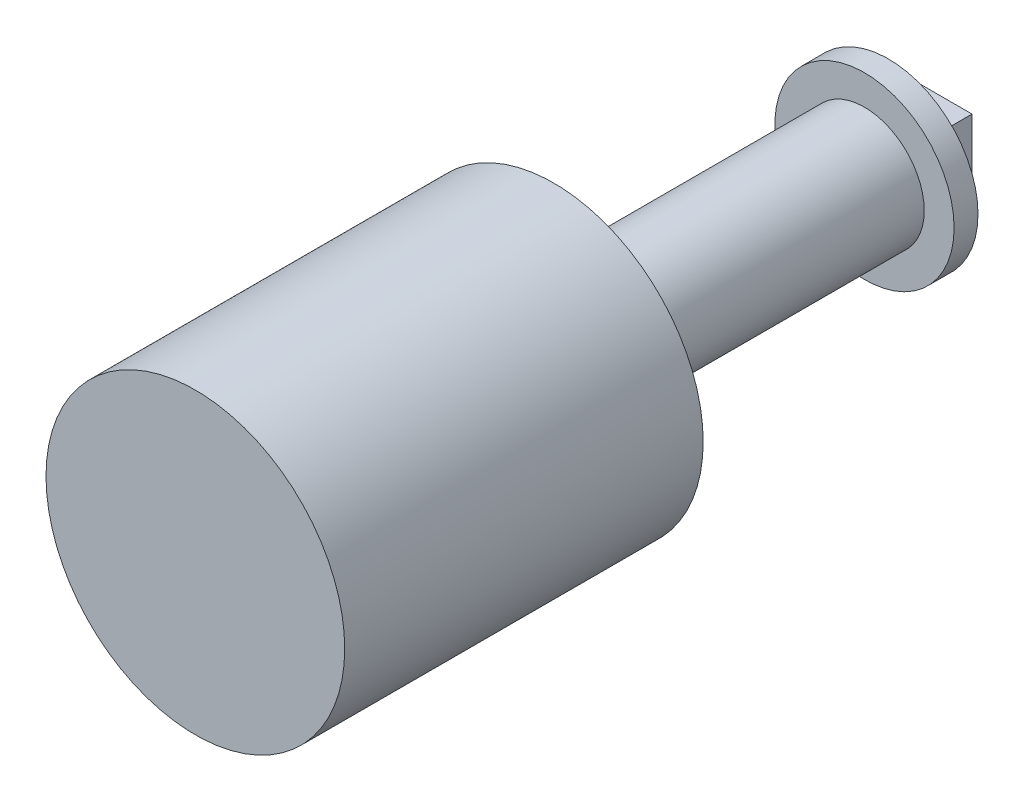
ISO-10303-21;
HEADER;
FILE_DESCRIPTION(('STEP AP214'),'2;1');
FILE_NAME('part.step','',(''),(''),'','','');
FILE_SCHEMA(('AUTOMOTIVE_DESIGN { 1 0 10303 214 1 1 1 1 }'));
ENDSEC;
DATA;
#1=APPLICATION_CONTEXT('core data for automotive mechanical design processes');
#2=APPLICATION_PROTOCOL_DEFINITION('international standard','automotive_design',2000,#1);
#3=PRODUCT_CONTEXT('',#1,'mechanical');
#4=PRODUCT('Part','Part','',(#3));
#5=PRODUCT_RELATED_PRODUCT_CATEGORY('part','',(#4));
#6=PRODUCT_DEFINITION_FORMATION('','',#4);
#7=PRODUCT_DEFINITION_CONTEXT('part definition',#1,'design');
#8=PRODUCT_DEFINITION('design','',#6,#7);
#9=PRODUCT_DEFINITION_SHAPE('','',#8);
#10=(LENGTH_UNIT() NAMED_UNIT(*) SI_UNIT(.MILLI.,.METRE.));
#11=(NAMED_UNIT(*) PLANE_ANGLE_UNIT() SI_UNIT($,.RADIAN.));
#12=(NAMED_UNIT(*) SI_UNIT($,.STERADIAN.) SOLID_ANGLE_UNIT());
#13=UNCERTAINTY_MEASURE_WITH_UNIT(LENGTH_MEASURE(1.E-05),#10,'distance_accuracy_value','');
#14=(GEOMETRIC_REPRESENTATION_CONTEXT(3) GLOBAL_UNCERTAINTY_ASSIGNED_CONTEXT((#13)) GLOBAL_UNIT_ASSIGNED_CONTEXT((#10,
#11,#12)) REPRESENTATION_CONTEXT('',''));
#15=CARTESIAN_POINT('',(0.,0.,0.));
#16=DIRECTION('',(0.,0.,1.));
#17=DIRECTION('',(1.,0.,0.));
#18=AXIS2_PLACEMENT_3D('',#15,#16,#17);
#19=CARTESIAN_POINT('',(0.,0.,-28.));
#20=DIRECTION('',(0.,0.,1.));
#21=DIRECTION('',(1.,0.,0.));
#22=AXIS2_PLACEMENT_3D('',#19,#20,#21);
#23=PLANE('',#22);
#24=CARTESIAN_POINT('',(0.,0.,-28.));
#25=DIRECTION('',(0.,0.,1.));
#26=DIRECTION('',(1.,0.,0.));
#27=AXIS2_PLACEMENT_3D('',#24,#25,#26);
#28=CIRCLE('',#27,7.50000000000351);
#29=CARTESIAN_POINT('',(7.50000000000341,0.,-28.));
#30=VERTEX_POINT('',#29);
#31=EDGE_CURVE('E112',#30,#30,#28,.T.);
#32=ORIENTED_EDGE('',*,*,#31,.F.);
#33=EDGE_LOOP('',(#32));
#34=FACE_BOUND('',#33,.T.);
#35=DIRECTION('',(0.,1.,0.));
#36=VECTOR('',#35,1.);
#37=CARTESIAN_POINT('',(-3.0000000000001,3.,-28.));
#38=LINE('',#37,#36);
#39=CARTESIAN_POINT('',(-3.0000000000001,-3.,-28.));
#40=VERTEX_POINT('',#39);
#41=CARTESIAN_POINT('',(-3.0000000000001,3.,-28.));
#42=VERTEX_POINT('',#41);
#43=EDGE_CURVE('E55',#40,#42,#38,.T.);
#44=ORIENTED_EDGE('',*,*,#43,.F.);
#45=DIRECTION('',(-1.,0.,0.));
#46=VECTOR('',#45,1.);
#47=CARTESIAN_POINT('',(2.9999999999999,-3.,-28.));
#48=LINE('',#47,#46);
#49=CARTESIAN_POINT('',(2.9999999999999,-3.,-28.));
#50=VERTEX_POINT('',#49);
#51=EDGE_CURVE('E59',#50,#40,#48,.T.);
#52=ORIENTED_EDGE('',*,*,#51,.F.);
#53=DIRECTION('',(0.,-1.,0.));
#54=VECTOR('',#53,1.);
#55=CARTESIAN_POINT('',(2.9999999999999,3.,-28.));
#56=LINE('',#55,#54);
#57=CARTESIAN_POINT('',(2.9999999999999,3.,-28.));
#58=VERTEX_POINT('',#57);
#59=EDGE_CURVE('E324',#58,#50,#56,.T.);
#60=ORIENTED_EDGE('',*,*,#59,.F.);
#61=DIRECTION('',(1.,0.,0.));
#62=VECTOR('',#61,1.);
#63=CARTESIAN_POINT('',(2.9999999999999,3.,-28.));
#64=LINE('',#63,#62);
#65=EDGE_CURVE('E330',#42,#58,#64,.T.);
#66=ORIENTED_EDGE('',*,*,#65,.F.);
#67=EDGE_LOOP('',(#44,#52,#60,#66));
#68=FACE_BOUND('',#67,.T.);
#69=ADVANCED_FACE('F40',(#34,#68),#23,.F.);
#70=CARTESIAN_POINT('',(0.,0.,30.));
#71=DIRECTION('',(0.,0.,-1.));
#72=DIRECTION('',(-1.,0.,0.));
#73=AXIS2_PLACEMENT_3D('',#70,#71,#72);
#74=CYLINDRICAL_SURFACE('',#73,12.5);
#75=CARTESIAN_POINT('',(0.,0.,30.));
#76=DIRECTION('',(0.,0.,1.));
#77=DIRECTION('',(1.,0.,0.));
#78=AXIS2_PLACEMENT_3D('',#75,#76,#77);
#79=CIRCLE('',#78,12.5);
#80=CARTESIAN_POINT('',(12.5,0.,30.));
#81=VERTEX_POINT('',#80);
#82=EDGE_CURVE('E48',#81,#81,#79,.T.);
#83=ORIENTED_EDGE('',*,*,#82,.F.);
#84=EDGE_LOOP('',(#83));
#85=FACE_BOUND('',#84,.T.);
#86=CARTESIAN_POINT('',(0.,0.,0.));
#87=DIRECTION('',(0.,0.,1.));
#88=DIRECTION('',(1.,0.,0.));
#89=AXIS2_PLACEMENT_3D('',#86,#87,#88);
#90=CIRCLE('',#89,12.5);
#91=CARTESIAN_POINT('',(12.5,0.,0.));
#92=VERTEX_POINT('',#91);
#93=EDGE_CURVE('E125',#92,#92,#90,.T.);
#94=ORIENTED_EDGE('',*,*,#93,.T.);
#95=EDGE_LOOP('',(#94));
#96=FACE_BOUND('',#95,.T.);
#97=ADVANCED_FACE('F42',(#85,#96),#74,.T.);
#98=CARTESIAN_POINT('',(0.,0.,30.));
#99=DIRECTION('',(0.,0.,1.));
#100=DIRECTION('',(1.,0.,0.));
#101=AXIS2_PLACEMENT_3D('',#98,#99,#100);
#102=PLANE('',#101);
#103=ORIENTED_EDGE('',*,*,#82,.T.);
#104=EDGE_LOOP('',(#103));
#105=FACE_BOUND('',#104,.T.);
#106=ADVANCED_FACE('F142',(#105),#102,.T.);
#107=CARTESIAN_POINT('',(0.,0.,0.));
#108=DIRECTION('',(0.,0.,1.));
#109=DIRECTION('',(1.,0.,0.));
#110=AXIS2_PLACEMENT_3D('',#107,#108,#109);
#111=PLANE('',#110);
#112=CARTESIAN_POINT('',(0.,0.,0.));
#113=DIRECTION('',(0.,0.,1.));
#114=DIRECTION('',(1.,0.,0.));
#115=AXIS2_PLACEMENT_3D('',#112,#113,#114);
#116=CIRCLE('',#115,0.750000000000008);
#117=CARTESIAN_POINT('',(0.750000000000008,0.,0.));
#118=VERTEX_POINT('',#117);
#119=EDGE_CURVE('E11',#118,#118,#116,.F.);
#120=ORIENTED_EDGE('',*,*,#119,.F.);
#121=EDGE_LOOP('',(#120));
#122=FACE_BOUND('',#121,.T.);
#123=CARTESIAN_POINT('',(8.49999999999995,0.,0.));
#124=DIRECTION('',(0.,0.,-1.));
#125=DIRECTION('',(-1.,0.,0.));
#126=AXIS2_PLACEMENT_3D('',#123,#124,#125);
#127=CIRCLE('',#126,1.5);
#128=CARTESIAN_POINT('',(6.99999999999995,0.,0.));
#129=VERTEX_POINT('',#128);
#130=EDGE_CURVE('E126',#129,#129,#127,.T.);
#131=ORIENTED_EDGE('',*,*,#130,.F.);
#132=EDGE_LOOP('',(#131));
#133=FACE_BOUND('',#132,.T.);
#134=CARTESIAN_POINT('',(-8.49999999999995,0.,0.));
#135=DIRECTION('',(0.,0.,-1.));
#136=DIRECTION('',(1.,0.,0.));
#137=AXIS2_PLACEMENT_3D('',#134,#135,#136);
#138=CIRCLE('',#137,1.5);
#139=CARTESIAN_POINT('',(-6.99999999999995,0.,0.));
#140=VERTEX_POINT('',#139);
#141=EDGE_CURVE('E121',#140,#140,#138,.T.);
#142=ORIENTED_EDGE('',*,*,#141,.F.);
#143=EDGE_LOOP('',(#142));
#144=FACE_BOUND('',#143,.T.);
#145=ORIENTED_EDGE('',*,*,#93,.F.);
#146=EDGE_LOOP('',(#145));
#147=FACE_BOUND('',#146,.T.);
#148=ADVANCED_FACE('F139',(#122,#133,#144,#147),#111,.F.);
#149=CARTESIAN_POINT('',(-8.49999999999995,0.,0.5));
#150=DIRECTION('',(0.,0.,-1.));
#151=DIRECTION('',(-1.,0.,0.));
#152=AXIS2_PLACEMENT_3D('',#149,#150,#151);
#153=CYLINDRICAL_SURFACE('',#152,1.5);
#154=CARTESIAN_POINT('',(-8.49999999999995,0.,0.5));
#155=DIRECTION('',(0.,0.,-1.));
#156=DIRECTION('',(1.,0.,0.));
#157=AXIS2_PLACEMENT_3D('',#154,#155,#156);
#158=CIRCLE('',#157,1.5);
#159=CARTESIAN_POINT('',(-6.99999999999995,0.,0.5));
#160=VERTEX_POINT('',#159);
#161=EDGE_CURVE('E129',#160,#160,#158,.T.);
#162=ORIENTED_EDGE('',*,*,#161,.F.);
#163=EDGE_LOOP('',(#162));
#164=FACE_BOUND('',#163,.T.);
#165=ORIENTED_EDGE('',*,*,#141,.T.);
#166=EDGE_LOOP('',(#165));
#167=FACE_BOUND('',#166,.T.);
#168=ADVANCED_FACE('F141',(#164,#167),#153,.F.);
#169=CARTESIAN_POINT('',(-8.49999999999995,0.,0.5));
#170=DIRECTION('',(0.,0.,1.));
#171=DIRECTION('',(1.,0.,0.));
#172=AXIS2_PLACEMENT_3D('',#169,#170,#171);
#173=PLANE('',#172);
#174=ORIENTED_EDGE('',*,*,#161,.T.);
#175=EDGE_LOOP('',(#174));
#176=FACE_BOUND('',#175,.T.);
#177=ADVANCED_FACE('F148',(#176),#173,.F.);
#178=CARTESIAN_POINT('',(8.49999999999995,0.,0.5));
#179=DIRECTION('',(0.,0.,-1.));
#180=DIRECTION('',(-1.,0.,0.));
#181=AXIS2_PLACEMENT_3D('',#178,#179,#180);
#182=CYLINDRICAL_SURFACE('',#181,1.5);
#183=CARTESIAN_POINT('',(8.49999999999995,0.,0.5));
#184=DIRECTION('',(0.,0.,-1.));
#185=DIRECTION('',(-1.,0.,0.));
#186=AXIS2_PLACEMENT_3D('',#183,#184,#185);
#187=CIRCLE('',#186,1.5);
#188=CARTESIAN_POINT('',(6.99999999999995,0.,0.5));
#189=VERTEX_POINT('',#188);
#190=EDGE_CURVE('E122',#189,#189,#187,.T.);
#191=ORIENTED_EDGE('',*,*,#190,.F.);
#192=EDGE_LOOP('',(#191));
#193=FACE_BOUND('',#192,.T.);
#194=ORIENTED_EDGE('',*,*,#130,.T.);
#195=EDGE_LOOP('',(#194));
#196=FACE_BOUND('',#195,.T.);
#197=ADVANCED_FACE('F182',(#193,#196),#182,.F.);
#198=CARTESIAN_POINT('',(8.49999999999995,0.,0.5));
#199=DIRECTION('',(0.,0.,-1.));
#200=DIRECTION('',(-1.,0.,0.));
#201=AXIS2_PLACEMENT_3D('',#198,#199,#200);
#202=PLANE('',#201);
#203=ORIENTED_EDGE('',*,*,#190,.T.);
#204=EDGE_LOOP('',(#203));
#205=FACE_BOUND('',#204,.T.);
#206=ADVANCED_FACE('F178',(#205),#202,.T.);
#207=CARTESIAN_POINT('',(3.43024899888577E-12,0.,1000.));
#208=DIRECTION('',(0.,0.,1.));
#209=DIRECTION('',(1.,0.,0.));
#210=AXIS2_PLACEMENT_3D('',#207,#208,#209);
#211=CYLINDRICAL_SURFACE('',#210,5.00000000000009);
#212=CARTESIAN_POINT('',(0.,0.,-4.99999999999989));
#213=DIRECTION('',(0.,0.,1.));
#214=DIRECTION('',(1.,0.,0.));
#215=AXIS2_PLACEMENT_3D('',#212,#213,#214);
#216=CIRCLE('',#215,5.00000000000002);
#217=CARTESIAN_POINT('',(5.,0.,-4.99999999999991));
#218=VERTEX_POINT('',#217);
#219=EDGE_CURVE('E101',#218,#218,#216,.T.);
#220=ORIENTED_EDGE('',*,*,#219,.F.);
#221=EDGE_LOOP('',(#220));
#222=FACE_BOUND('',#221,.T.);
#223=CARTESIAN_POINT('',(0.,0.,-25.9999999999998));
#224=DIRECTION('',(0.,0.,1.));
#225=DIRECTION('',(1.,0.,0.));
#226=AXIS2_PLACEMENT_3D('',#223,#224,#225);
#227=CIRCLE('',#226,5.00000000000017);
#228=CARTESIAN_POINT('',(5.00000000000008,0.,-25.9999999999998));
#229=VERTEX_POINT('',#228);
#230=EDGE_CURVE('E118',#229,#229,#227,.T.);
#231=ORIENTED_EDGE('',*,*,#230,.T.);
#232=EDGE_LOOP('',(#231));
#233=FACE_BOUND('',#232,.T.);
#234=ADVANCED_FACE('F174',(#222,#233),#211,.T.);
#235=CARTESIAN_POINT('',(2.16493489801623E-12,0.,-25.9999999999998));
#236=DIRECTION('',(0.,0.,1.));
#237=DIRECTION('',(1.,0.,0.));
#238=AXIS2_PLACEMENT_3D('',#235,#236,#237);
#239=PLANE('',#238);
#240=CARTESIAN_POINT('',(0.,0.,-25.9999999999998));
#241=DIRECTION('',(0.,0.,1.));
#242=DIRECTION('',(1.,0.,0.));
#243=AXIS2_PLACEMENT_3D('',#240,#241,#242);
#244=CIRCLE('',#243,7.50000000000346);
#245=CARTESIAN_POINT('',(7.50000000000337,0.,-25.9999999999998));
#246=VERTEX_POINT('',#245);
#247=EDGE_CURVE('E115',#246,#246,#244,.T.);
#248=ORIENTED_EDGE('',*,*,#247,.T.);
#249=EDGE_LOOP('',(#248));
#250=FACE_BOUND('',#249,.T.);
#251=ORIENTED_EDGE('',*,*,#230,.F.);
#252=EDGE_LOOP('',(#251));
#253=FACE_BOUND('',#252,.T.);
#254=ADVANCED_FACE('F170',(#250,#253),#239,.T.);
#255=CARTESIAN_POINT('',(3.43024899888577E-12,0.,1000.));
#256=DIRECTION('',(0.,0.,1.));
#257=DIRECTION('',(1.,0.,0.));
#258=AXIS2_PLACEMENT_3D('',#255,#256,#257);
#259=CYLINDRICAL_SURFACE('',#258,7.50000000000348);
#260=ORIENTED_EDGE('',*,*,#31,.T.);
#261=EDGE_LOOP('',(#260));
#262=FACE_BOUND('',#261,.T.);
#263=ORIENTED_EDGE('',*,*,#247,.F.);
#264=EDGE_LOOP('',(#263));
#265=FACE_BOUND('',#264,.T.);
#266=ADVANCED_FACE('F167',(#262,#265),#259,.T.);
#267=CARTESIAN_POINT('',(3.43024899888577E-12,0.,1000.));
#268=DIRECTION('',(0.,0.,1.));
#269=DIRECTION('',(1.,0.,0.));
#270=AXIS2_PLACEMENT_3D('',#267,#268,#269);
#271=CYLINDRICAL_SURFACE('',#270,0.750000000000008);
#272=ORIENTED_EDGE('',*,*,#119,.T.);
#273=EDGE_LOOP('',(#272));
#274=FACE_BOUND('',#273,.T.);
#275=CARTESIAN_POINT('',(0.,0.,-4.99999999999989));
#276=DIRECTION('',(0.,0.,1.));
#277=DIRECTION('',(1.,0.,0.));
#278=AXIS2_PLACEMENT_3D('',#275,#276,#277);
#279=CIRCLE('',#278,0.750000000000016);
#280=CARTESIAN_POINT('',(0.749999999999999,0.,-4.9999999999999));
#281=VERTEX_POINT('',#280);
#282=EDGE_CURVE('E104',#281,#281,#279,.T.);
#283=ORIENTED_EDGE('',*,*,#282,.T.);
#284=EDGE_LOOP('',(#283));
#285=FACE_BOUND('',#284,.T.);
#286=ADVANCED_FACE('F165',(#274,#285),#271,.T.);
#287=CARTESIAN_POINT('',(0.,0.,-4.99999999999999));
#288=DIRECTION('',(0.,0.,1.));
#289=DIRECTION('',(1.,0.,0.));
#290=AXIS2_PLACEMENT_3D('',#287,#288,#289);
#291=PLANE('',#290);
#292=ORIENTED_EDGE('',*,*,#219,.T.);
#293=EDGE_LOOP('',(#292));
#294=FACE_BOUND('',#293,.T.);
#295=ORIENTED_EDGE('',*,*,#282,.F.);
#296=EDGE_LOOP('',(#295));
#297=FACE_BOUND('',#296,.T.);
#298=ADVANCED_FACE('F224',(#294,#297),#291,.T.);
#299=CARTESIAN_POINT('',(-3.00000000000011,3.,-32.));
#300=DIRECTION('',(1.,0.,0.));
#301=DIRECTION('',(0.,0.,-1.));
#302=AXIS2_PLACEMENT_3D('',#299,#300,#301);
#303=PLANE('',#302);
#304=ORIENTED_EDGE('',*,*,#43,.T.);
#305=DIRECTION('',(0.,0.,1.));
#306=VECTOR('',#305,1.);
#307=CARTESIAN_POINT('',(-3.00000000000011,3.,-32.));
#308=LINE('',#307,#306);
#309=CARTESIAN_POINT('',(-3.00000000000011,3.,-32.));
#310=VERTEX_POINT('',#309);
#311=EDGE_CURVE('E84',#310,#42,#308,.T.);
#312=ORIENTED_EDGE('',*,*,#311,.F.);
#313=DIRECTION('',(0.,1.,0.));
#314=VECTOR('',#313,1.);
#315=CARTESIAN_POINT('',(-3.00000000000011,3.,-32.));
#316=LINE('',#315,#314);
#317=CARTESIAN_POINT('',(-3.00000000000011,-3.,-32.));
#318=VERTEX_POINT('',#317);
#319=EDGE_CURVE('E90',#318,#310,#316,.T.);
#320=ORIENTED_EDGE('',*,*,#319,.F.);
#321=DIRECTION('',(0.,0.,1.));
#322=VECTOR('',#321,1.);
#323=CARTESIAN_POINT('',(-3.00000000000011,-3.,-32.));
#324=LINE('',#323,#322);
#325=EDGE_CURVE('E322',#318,#40,#324,.T.);
#326=ORIENTED_EDGE('',*,*,#325,.T.);
#327=EDGE_LOOP('',(#304,#312,#320,#326));
#328=FACE_BOUND('',#327,.T.);
#329=ADVANCED_FACE('F100',(#328),#303,.F.);
#330=CARTESIAN_POINT('',(2.99999999999989,3.,-32.));
#331=DIRECTION('',(0.,-1.,0.));
#332=DIRECTION('',(0.,0.,-1.));
#333=AXIS2_PLACEMENT_3D('',#330,#331,#332);
#334=PLANE('',#333);
#335=ORIENTED_EDGE('',*,*,#65,.T.);
#336=DIRECTION('',(0.,0.,1.));
#337=VECTOR('',#336,1.);
#338=CARTESIAN_POINT('',(2.99999999999989,3.,-32.));
#339=LINE('',#338,#337);
#340=CARTESIAN_POINT('',(2.99999999999989,3.,-32.));
#341=VERTEX_POINT('',#340);
#342=EDGE_CURVE('E86',#341,#58,#339,.T.);
#343=ORIENTED_EDGE('',*,*,#342,.F.);
#344=DIRECTION('',(1.,0.,0.));
#345=VECTOR('',#344,1.);
#346=CARTESIAN_POINT('',(2.99999999999989,3.,-32.));
#347=LINE('',#346,#345);
#348=EDGE_CURVE('E79',#310,#341,#347,.T.);
#349=ORIENTED_EDGE('',*,*,#348,.F.);
#350=ORIENTED_EDGE('',*,*,#311,.T.);
#351=EDGE_LOOP('',(#335,#343,#349,#350));
#352=FACE_BOUND('',#351,.T.);
#353=ADVANCED_FACE('F82',(#352),#334,.F.);
#354=CARTESIAN_POINT('',(2.99999999999989,3.,-32.));
#355=DIRECTION('',(-1.,0.,0.));
#356=DIRECTION('',(0.,0.,1.));
#357=AXIS2_PLACEMENT_3D('',#354,#355,#356);
#358=PLANE('',#357);
#359=ORIENTED_EDGE('',*,*,#59,.T.);
#360=DIRECTION('',(0.,0.,1.));
#361=VECTOR('',#360,1.);
#362=CARTESIAN_POINT('',(2.99999999999989,-3.,-32.));
#363=LINE('',#362,#361);
#364=CARTESIAN_POINT('',(2.99999999999989,-3.,-32.));
#365=VERTEX_POINT('',#364);
#366=EDGE_CURVE('E106',#365,#50,#363,.T.);
#367=ORIENTED_EDGE('',*,*,#366,.F.);
#368=DIRECTION('',(0.,-1.,0.));
#369=VECTOR('',#368,1.);
#370=CARTESIAN_POINT('',(2.99999999999989,3.,-32.));
#371=LINE('',#370,#369);
#372=EDGE_CURVE('E89',#341,#365,#371,.T.);
#373=ORIENTED_EDGE('',*,*,#372,.F.);
#374=ORIENTED_EDGE('',*,*,#342,.T.);
#375=EDGE_LOOP('',(#359,#367,#373,#374));
#376=FACE_BOUND('',#375,.T.);
#377=ADVANCED_FACE('F242',(#376),#358,.F.);
#378=CARTESIAN_POINT('',(2.99999999999989,-3.,-32.));
#379=DIRECTION('',(0.,1.,0.));
#380=DIRECTION('',(0.,0.,1.));
#381=AXIS2_PLACEMENT_3D('',#378,#379,#380);
#382=PLANE('',#381);
#383=ORIENTED_EDGE('',*,*,#51,.T.);
#384=ORIENTED_EDGE('',*,*,#325,.F.);
#385=DIRECTION('',(-1.,0.,0.));
#386=VECTOR('',#385,1.);
#387=CARTESIAN_POINT('',(2.99999999999989,-3.,-32.));
#388=LINE('',#387,#386);
#389=EDGE_CURVE('E95',#365,#318,#388,.T.);
#390=ORIENTED_EDGE('',*,*,#389,.F.);
#391=ORIENTED_EDGE('',*,*,#366,.T.);
#392=EDGE_LOOP('',(#383,#384,#390,#391));
#393=FACE_BOUND('',#392,.T.);
#394=ADVANCED_FACE('F249',(#393),#382,.F.);
#395=CARTESIAN_POINT('',(-1.10865510650244E-13,0.,-32.));
#396=DIRECTION('',(0.,0.,-1.));
#397=DIRECTION('',(-1.,0.,0.));
#398=AXIS2_PLACEMENT_3D('',#395,#396,#397);
#399=PLANE('',#398);
#400=ORIENTED_EDGE('',*,*,#319,.T.);
#401=ORIENTED_EDGE('',*,*,#348,.T.);
#402=ORIENTED_EDGE('',*,*,#372,.T.);
#403=ORIENTED_EDGE('',*,*,#389,.T.);
#404=EDGE_LOOP('',(#400,#401,#402,#403));
#405=FACE_BOUND('',#404,.T.);
#406=ADVANCED_FACE('F93',(#405),#399,.T.);
#407=CLOSED_SHELL('',(#69,#97,#106,#148,#168,#177,#197,#206,#234,#254,#266,#286,#298,#329,#353,
#377,#394,#406));
#408=MANIFOLD_SOLID_BREP('B2',#407);
#409=ADVANCED_BREP_SHAPE_REPRESENTATION('',(#18,#408),#14);
#410=SHAPE_DEFINITION_REPRESENTATION(#9,#409);
ENDSEC;
END-ISO-10303-21;
